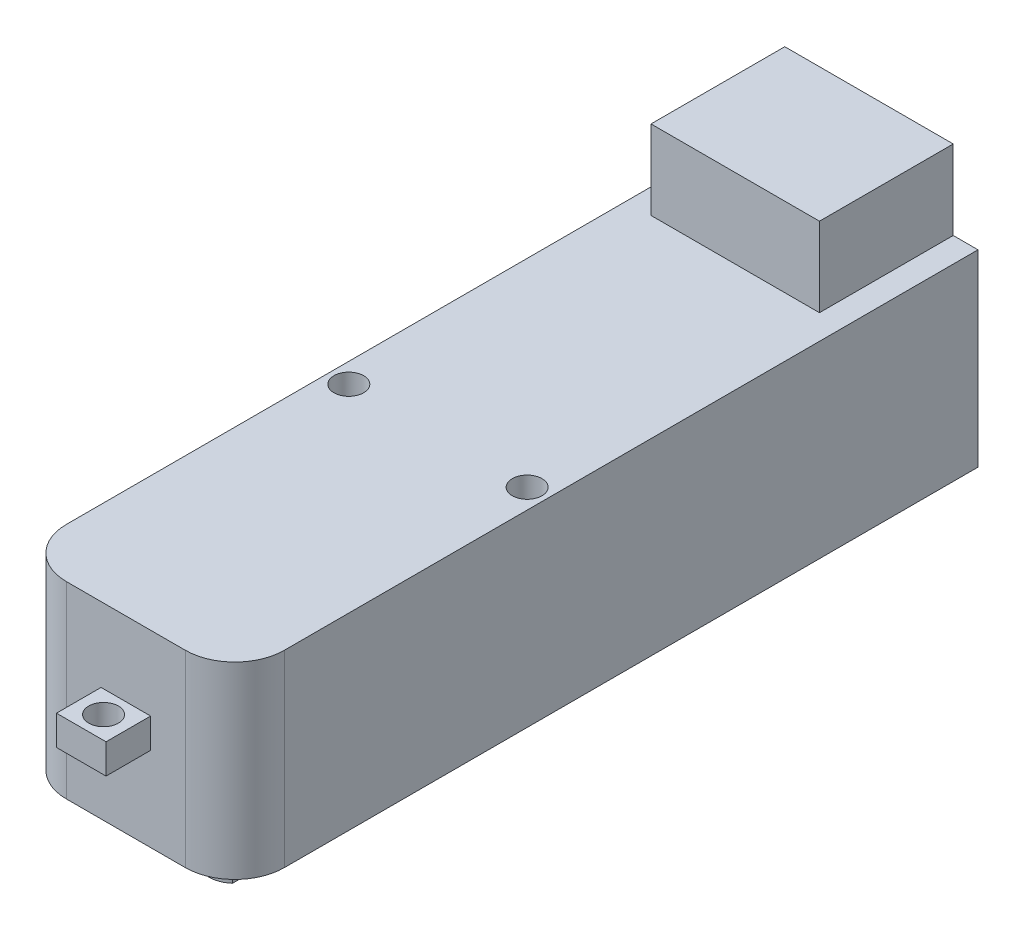
ISO-10303-21;
HEADER;
FILE_DESCRIPTION(('STEP AP214'),'2;1');
FILE_NAME('part.step','',(''),(''),'','','');
FILE_SCHEMA(('AUTOMOTIVE_DESIGN { 1 0 10303 214 1 1 1 1 }'));
ENDSEC;
DATA;
#1=APPLICATION_CONTEXT('core data for automotive mechanical design processes');
#2=APPLICATION_PROTOCOL_DEFINITION('international standard','automotive_design',2000,#1);
#3=PRODUCT_CONTEXT('',#1,'mechanical');
#4=PRODUCT('Part','Part','',(#3));
#5=PRODUCT_RELATED_PRODUCT_CATEGORY('part','',(#4));
#6=PRODUCT_DEFINITION_FORMATION('','',#4);
#7=PRODUCT_DEFINITION_CONTEXT('part definition',#1,'design');
#8=PRODUCT_DEFINITION('design','',#6,#7);
#9=PRODUCT_DEFINITION_SHAPE('','',#8);
#10=(LENGTH_UNIT() NAMED_UNIT(*) SI_UNIT(.MILLI.,.METRE.));
#11=(NAMED_UNIT(*) PLANE_ANGLE_UNIT() SI_UNIT($,.RADIAN.));
#12=(NAMED_UNIT(*) SI_UNIT($,.STERADIAN.) SOLID_ANGLE_UNIT());
#13=UNCERTAINTY_MEASURE_WITH_UNIT(LENGTH_MEASURE(1.E-05),#10,'distance_accuracy_value','');
#14=(GEOMETRIC_REPRESENTATION_CONTEXT(3) GLOBAL_UNCERTAINTY_ASSIGNED_CONTEXT((#13)) GLOBAL_UNIT_ASSIGNED_CONTEXT((#10,
#11,#12)) REPRESENTATION_CONTEXT('',''));
#15=CARTESIAN_POINT('',(0.,0.,0.));
#16=DIRECTION('',(0.,0.,1.));
#17=DIRECTION('',(1.,0.,0.));
#18=AXIS2_PLACEMENT_3D('',#15,#16,#17);
#19=CARTESIAN_POINT('',(0.,19.,0.));
#20=DIRECTION('',(0.,0.,-1.));
#21=DIRECTION('',(-1.,0.,0.));
#22=AXIS2_PLACEMENT_3D('',#19,#20,#21);
#23=PLANE('',#22);
#24=DIRECTION('',(1.,0.,0.));
#25=VECTOR('',#24,1.);
#26=CARTESIAN_POINT('',(0.,19.,0.));
#27=LINE('',#26,#25);
#28=CARTESIAN_POINT('',(5.,19.,0.));
#29=VERTEX_POINT('',#28);
#30=CARTESIAN_POINT('',(17.,19.,0.));
#31=VERTEX_POINT('',#30);
#32=EDGE_CURVE('E296',#29,#31,#27,.T.);
#33=ORIENTED_EDGE('',*,*,#32,.F.);
#34=DIRECTION('',(0.,-1.,0.));
#35=VECTOR('',#34,1.);
#36=CARTESIAN_POINT('',(5.,19.,0.));
#37=LINE('',#36,#35);
#38=CARTESIAN_POINT('',(5.,0.,0.));
#39=VERTEX_POINT('',#38);
#40=EDGE_CURVE('E331',#29,#39,#37,.T.);
#41=ORIENTED_EDGE('',*,*,#40,.T.);
#42=DIRECTION('',(1.,0.,0.));
#43=VECTOR('',#42,1.);
#44=CARTESIAN_POINT('',(0.,0.,0.));
#45=LINE('',#44,#43);
#46=CARTESIAN_POINT('',(17.,0.,0.));
#47=VERTEX_POINT('',#46);
#48=EDGE_CURVE('E312',#39,#47,#45,.T.);
#49=ORIENTED_EDGE('',*,*,#48,.T.);
#50=DIRECTION('',(0.,-1.,0.));
#51=VECTOR('',#50,1.);
#52=CARTESIAN_POINT('',(17.,19.,0.));
#53=LINE('',#52,#51);
#54=EDGE_CURVE('E328',#47,#31,#53,.F.);
#55=ORIENTED_EDGE('',*,*,#54,.T.);
#56=EDGE_LOOP('',(#33,#41,#49,#55));
#57=FACE_BOUND('',#56,.T.);
#58=DIRECTION('',(0.,-1.,0.));
#59=VECTOR('',#58,1.);
#60=CARTESIAN_POINT('',(8.49999999999999,11.5,0.));
#61=LINE('',#60,#59);
#62=CARTESIAN_POINT('',(8.49999999999999,11.5,0.));
#63=VERTEX_POINT('',#62);
#64=CARTESIAN_POINT('',(8.49999999999999,8.5,0.));
#65=VERTEX_POINT('',#64);
#66=EDGE_CURVE('E194',#63,#65,#61,.T.);
#67=ORIENTED_EDGE('',*,*,#66,.F.);
#68=DIRECTION('',(-1.,0.,0.));
#69=VECTOR('',#68,1.);
#70=CARTESIAN_POINT('',(8.49999999999999,11.5,0.));
#71=LINE('',#70,#69);
#72=CARTESIAN_POINT('',(13.5,11.5,0.));
#73=VERTEX_POINT('',#72);
#74=EDGE_CURVE('E191',#73,#63,#71,.T.);
#75=ORIENTED_EDGE('',*,*,#74,.F.);
#76=DIRECTION('',(0.,1.,0.));
#77=VECTOR('',#76,1.);
#78=CARTESIAN_POINT('',(13.5,11.5,0.));
#79=LINE('',#78,#77);
#80=CARTESIAN_POINT('',(13.5,8.5,0.));
#81=VERTEX_POINT('',#80);
#82=EDGE_CURVE('E68',#81,#73,#79,.T.);
#83=ORIENTED_EDGE('',*,*,#82,.F.);
#84=DIRECTION('',(1.,0.,0.));
#85=VECTOR('',#84,1.);
#86=CARTESIAN_POINT('',(8.49999999999999,8.5,0.));
#87=LINE('',#86,#85);
#88=EDGE_CURVE('E63',#65,#81,#87,.T.);
#89=ORIENTED_EDGE('',*,*,#88,.F.);
#90=EDGE_LOOP('',(#67,#75,#83,#89));
#91=FACE_BOUND('',#90,.T.);
#92=ADVANCED_FACE('F47',(#57,#91),#23,.F.);
#93=CARTESIAN_POINT('',(11.,-8.,-11.));
#94=DIRECTION('',(0.,1.,0.));
#95=DIRECTION('',(0.,0.,1.));
#96=AXIS2_PLACEMENT_3D('',#93,#94,#95);
#97=CYLINDRICAL_SURFACE('',#96,2.65);
#98=CARTESIAN_POINT('',(11.,-8.,-11.));
#99=DIRECTION('',(0.,-1.,0.));
#100=DIRECTION('',(0.,0.,-1.));
#101=AXIS2_PLACEMENT_3D('',#98,#99,#100);
#102=CIRCLE('',#101,2.65);
#103=CARTESIAN_POINT('',(12.75,-8.,-9.01002512578676));
#104=VERTEX_POINT('',#103);
#105=CARTESIAN_POINT('',(9.24999999999999,-8.,-9.01002512578676));
#106=VERTEX_POINT('',#105);
#107=EDGE_CURVE('E241',#104,#106,#102,.T.);
#108=ORIENTED_EDGE('',*,*,#107,.F.);
#109=DIRECTION('',(0.,-1.,0.));
#110=VECTOR('',#109,1.);
#111=CARTESIAN_POINT('',(12.75,4.08044115262063,-9.01002512578676));
#112=LINE('',#111,#110);
#113=CARTESIAN_POINT('',(12.75,0.,-9.01002512578676));
#114=VERTEX_POINT('',#113);
#115=EDGE_CURVE('E211',#114,#104,#112,.T.);
#116=ORIENTED_EDGE('',*,*,#115,.F.);
#117=CARTESIAN_POINT('',(11.,0.,-11.));
#118=DIRECTION('',(0.,-1.,0.));
#119=DIRECTION('',(0.,0.,-1.));
#120=AXIS2_PLACEMENT_3D('',#117,#118,#119);
#121=CIRCLE('',#120,2.65);
#122=CARTESIAN_POINT('',(9.24999999999999,0.,-9.01002512578676));
#123=VERTEX_POINT('',#122);
#124=EDGE_CURVE('E250',#114,#123,#121,.T.);
#125=ORIENTED_EDGE('',*,*,#124,.T.);
#126=DIRECTION('',(0.,-1.,0.));
#127=VECTOR('',#126,1.);
#128=CARTESIAN_POINT('',(9.24999999999999,4.08044115262063,-9.01002512578676));
#129=LINE('',#128,#127);
#130=EDGE_CURVE('E200',#123,#106,#129,.T.);
#131=ORIENTED_EDGE('',*,*,#130,.T.);
#132=EDGE_LOOP('',(#108,#116,#125,#131));
#133=FACE_BOUND('',#132,.T.);
#134=ADVANCED_FACE('F371',(#133),#97,.T.);
#135=CARTESIAN_POINT('',(0.,19.,0.));
#136=DIRECTION('',(0.,-1.,0.));
#137=DIRECTION('',(0.,0.,-1.));
#138=AXIS2_PLACEMENT_3D('',#135,#136,#137);
#139=PLANE('',#138);
#140=CARTESIAN_POINT('',(20.,19.,-31.5));
#141=DIRECTION('',(0.,-1.,0.));
#142=DIRECTION('',(0.,0.,-1.));
#143=AXIS2_PLACEMENT_3D('',#140,#141,#142);
#144=CIRCLE('',#143,1.5);
#145=CARTESIAN_POINT('',(20.,19.,-33.));
#146=VERTEX_POINT('',#145);
#147=EDGE_CURVE('E236',#146,#146,#144,.T.);
#148=ORIENTED_EDGE('',*,*,#147,.T.);
#149=EDGE_LOOP('',(#148));
#150=FACE_BOUND('',#149,.T.);
#151=CARTESIAN_POINT('',(2.,19.,-31.5));
#152=DIRECTION('',(0.,-1.,0.));
#153=DIRECTION('',(0.,0.,-1.));
#154=AXIS2_PLACEMENT_3D('',#151,#152,#153);
#155=CIRCLE('',#154,1.5);
#156=CARTESIAN_POINT('',(2.,19.,-33.));
#157=VERTEX_POINT('',#156);
#158=EDGE_CURVE('E231',#157,#157,#155,.T.);
#159=ORIENTED_EDGE('',*,*,#158,.T.);
#160=EDGE_LOOP('',(#159));
#161=FACE_BOUND('',#160,.T.);
#162=DIRECTION('',(0.,0.,1.));
#163=VECTOR('',#162,1.);
#164=CARTESIAN_POINT('',(0.,19.,0.));
#165=LINE('',#164,#163);
#166=CARTESIAN_POINT('',(0.,19.,-75.));
#167=VERTEX_POINT('',#166);
#168=CARTESIAN_POINT('',(0.,19.,-5.));
#169=VERTEX_POINT('',#168);
#170=EDGE_CURVE('E292',#167,#169,#165,.T.);
#171=ORIENTED_EDGE('',*,*,#170,.T.);
#172=CARTESIAN_POINT('',(5.,19.,-5.));
#173=DIRECTION('',(0.,-1.,0.));
#174=DIRECTION('',(0.,0.,-1.));
#175=AXIS2_PLACEMENT_3D('',#172,#173,#174);
#176=CIRCLE('',#175,5.);
#177=EDGE_CURVE('E347',#169,#29,#176,.F.);
#178=ORIENTED_EDGE('',*,*,#177,.T.);
#179=ORIENTED_EDGE('',*,*,#32,.T.);
#180=CARTESIAN_POINT('',(17.,19.,-5.));
#181=DIRECTION('',(0.,-1.,0.));
#182=DIRECTION('',(0.,0.,-1.));
#183=AXIS2_PLACEMENT_3D('',#180,#181,#182);
#184=CIRCLE('',#183,5.);
#185=CARTESIAN_POINT('',(22.,19.,-5.));
#186=VERTEX_POINT('',#185);
#187=EDGE_CURVE('E344',#31,#186,#184,.F.);
#188=ORIENTED_EDGE('',*,*,#187,.T.);
#189=DIRECTION('',(0.,0.,-1.));
#190=VECTOR('',#189,1.);
#191=CARTESIAN_POINT('',(22.,19.,0.));
#192=LINE('',#191,#190);
#193=CARTESIAN_POINT('',(22.,19.,-75.));
#194=VERTEX_POINT('',#193);
#195=EDGE_CURVE('E301',#186,#194,#192,.T.);
#196=ORIENTED_EDGE('',*,*,#195,.T.);
#197=DIRECTION('',(-1.,0.,0.));
#198=VECTOR('',#197,1.);
#199=CARTESIAN_POINT('',(0.,19.,-75.));
#200=LINE('',#199,#198);
#201=CARTESIAN_POINT('',(19.5,19.,-75.));
#202=VERTEX_POINT('',#201);
#203=EDGE_CURVE('E305',#194,#202,#200,.T.);
#204=ORIENTED_EDGE('',*,*,#203,.T.);
#205=DIRECTION('',(0.,0.,-1.));
#206=VECTOR('',#205,1.);
#207=CARTESIAN_POINT('',(19.5,19.,-75.));
#208=LINE('',#207,#206);
#209=CARTESIAN_POINT('',(19.5,19.,-61.5));
#210=VERTEX_POINT('',#209);
#211=EDGE_CURVE('E256',#210,#202,#208,.T.);
#212=ORIENTED_EDGE('',*,*,#211,.F.);
#213=DIRECTION('',(1.,0.,0.));
#214=VECTOR('',#213,1.);
#215=CARTESIAN_POINT('',(2.5,19.,-61.5));
#216=LINE('',#215,#214);
#217=CARTESIAN_POINT('',(2.5,19.,-61.5));
#218=VERTEX_POINT('',#217);
#219=EDGE_CURVE('E269',#218,#210,#216,.T.);
#220=ORIENTED_EDGE('',*,*,#219,.F.);
#221=DIRECTION('',(0.,0.,1.));
#222=VECTOR('',#221,1.);
#223=CARTESIAN_POINT('',(2.49999999999999,19.,-75.));
#224=LINE('',#223,#222);
#225=CARTESIAN_POINT('',(2.49999999999999,19.,-75.));
#226=VERTEX_POINT('',#225);
#227=EDGE_CURVE('E245',#226,#218,#224,.T.);
#228=ORIENTED_EDGE('',*,*,#227,.F.);
#229=EDGE_CURVE('E304',#226,#167,#200,.T.);
#230=ORIENTED_EDGE('',*,*,#229,.T.);
#231=EDGE_LOOP('',(#171,#178,#179,#188,#196,#204,#212,#220,#228,#230));
#232=FACE_BOUND('',#231,.T.);
#233=ADVANCED_FACE('F391',(#150,#161,#232),#139,.F.);
#234=CARTESIAN_POINT('',(0.,19.,0.));
#235=DIRECTION('',(1.,0.,0.));
#236=DIRECTION('',(0.,0.,-1.));
#237=AXIS2_PLACEMENT_3D('',#234,#235,#236);
#238=PLANE('',#237);
#239=DIRECTION('',(0.,0.,1.));
#240=VECTOR('',#239,1.);
#241=CARTESIAN_POINT('',(0.,0.,0.));
#242=LINE('',#241,#240);
#243=CARTESIAN_POINT('',(0.,0.,-75.));
#244=VERTEX_POINT('',#243);
#245=CARTESIAN_POINT('',(0.,0.,-5.));
#246=VERTEX_POINT('',#245);
#247=EDGE_CURVE('E291',#244,#246,#242,.T.);
#248=ORIENTED_EDGE('',*,*,#247,.T.);
#249=DIRECTION('',(0.,-1.,0.));
#250=VECTOR('',#249,1.);
#251=CARTESIAN_POINT('',(0.,19.,-5.));
#252=LINE('',#251,#250);
#253=EDGE_CURVE('E341',#246,#169,#252,.F.);
#254=ORIENTED_EDGE('',*,*,#253,.T.);
#255=ORIENTED_EDGE('',*,*,#170,.F.);
#256=DIRECTION('',(0.,-1.,0.));
#257=VECTOR('',#256,1.);
#258=CARTESIAN_POINT('',(0.,19.,-75.));
#259=LINE('',#258,#257);
#260=EDGE_CURVE('E308',#167,#244,#259,.T.);
#261=ORIENTED_EDGE('',*,*,#260,.T.);
#262=EDGE_LOOP('',(#248,#254,#255,#261));
#263=FACE_BOUND('',#262,.T.);
#264=ADVANCED_FACE('F400',(#263),#238,.F.);
#265=CARTESIAN_POINT('',(22.,19.,0.));
#266=DIRECTION('',(-1.,0.,0.));
#267=DIRECTION('',(0.,0.,1.));
#268=AXIS2_PLACEMENT_3D('',#265,#266,#267);
#269=PLANE('',#268);
#270=ORIENTED_EDGE('',*,*,#195,.F.);
#271=DIRECTION('',(0.,-1.,0.));
#272=VECTOR('',#271,1.);
#273=CARTESIAN_POINT('',(22.,19.,-5.));
#274=LINE('',#273,#272);
#275=CARTESIAN_POINT('',(22.,0.,-5.));
#276=VERTEX_POINT('',#275);
#277=EDGE_CURVE('E350',#186,#276,#274,.T.);
#278=ORIENTED_EDGE('',*,*,#277,.T.);
#279=DIRECTION('',(0.,0.,-1.));
#280=VECTOR('',#279,1.);
#281=CARTESIAN_POINT('',(22.,0.,0.));
#282=LINE('',#281,#280);
#283=CARTESIAN_POINT('',(22.,0.,-75.));
#284=VERTEX_POINT('',#283);
#285=EDGE_CURVE('E316',#276,#284,#282,.T.);
#286=ORIENTED_EDGE('',*,*,#285,.T.);
#287=DIRECTION('',(0.,-1.,0.));
#288=VECTOR('',#287,1.);
#289=CARTESIAN_POINT('',(22.,19.,-75.));
#290=LINE('',#289,#288);
#291=EDGE_CURVE('E324',#194,#284,#290,.T.);
#292=ORIENTED_EDGE('',*,*,#291,.F.);
#293=EDGE_LOOP('',(#270,#278,#286,#292));
#294=FACE_BOUND('',#293,.T.);
#295=ADVANCED_FACE('F415',(#294),#269,.F.);
#296=CARTESIAN_POINT('',(0.,19.,-75.));
#297=DIRECTION('',(0.,0.,1.));
#298=DIRECTION('',(1.,0.,0.));
#299=AXIS2_PLACEMENT_3D('',#296,#297,#298);
#300=PLANE('',#299);
#301=DIRECTION('',(-1.,0.,0.));
#302=VECTOR('',#301,1.);
#303=CARTESIAN_POINT('',(0.,0.,-75.));
#304=LINE('',#303,#302);
#305=EDGE_CURVE('E297',#284,#244,#304,.T.);
#306=ORIENTED_EDGE('',*,*,#305,.T.);
#307=ORIENTED_EDGE('',*,*,#260,.F.);
#308=ORIENTED_EDGE('',*,*,#229,.F.);
#309=DIRECTION('',(0.,-1.,0.));
#310=VECTOR('',#309,1.);
#311=CARTESIAN_POINT('',(2.49999999999999,27.,-75.));
#312=LINE('',#311,#310);
#313=CARTESIAN_POINT('',(2.49999999999999,27.,-75.));
#314=VERTEX_POINT('',#313);
#315=EDGE_CURVE('E265',#314,#226,#312,.T.);
#316=ORIENTED_EDGE('',*,*,#315,.F.);
#317=DIRECTION('',(-1.,0.,0.));
#318=VECTOR('',#317,1.);
#319=CARTESIAN_POINT('',(2.49999999999999,27.,-75.));
#320=LINE('',#319,#318);
#321=CARTESIAN_POINT('',(19.5,27.,-75.));
#322=VERTEX_POINT('',#321);
#323=EDGE_CURVE('E262',#322,#314,#320,.T.);
#324=ORIENTED_EDGE('',*,*,#323,.F.);
#325=DIRECTION('',(0.,-1.,0.));
#326=VECTOR('',#325,1.);
#327=CARTESIAN_POINT('',(19.5,27.,-75.));
#328=LINE('',#327,#326);
#329=EDGE_CURVE('E279',#322,#202,#328,.T.);
#330=ORIENTED_EDGE('',*,*,#329,.T.);
#331=ORIENTED_EDGE('',*,*,#203,.F.);
#332=ORIENTED_EDGE('',*,*,#291,.T.);
#333=EDGE_LOOP('',(#306,#307,#308,#316,#324,#330,#331,#332));
#334=FACE_BOUND('',#333,.T.);
#335=ADVANCED_FACE('F396',(#334),#300,.F.);
#336=CARTESIAN_POINT('',(0.,0.,0.));
#337=DIRECTION('',(0.,-1.,0.));
#338=DIRECTION('',(0.,0.,-1.));
#339=AXIS2_PLACEMENT_3D('',#336,#337,#338);
#340=PLANE('',#339);
#341=CARTESIAN_POINT('',(11.,0.,-22.15));
#342=DIRECTION('',(0.,-1.,0.));
#343=DIRECTION('',(0.,0.,-1.));
#344=AXIS2_PLACEMENT_3D('',#341,#342,#343);
#345=CIRCLE('',#344,2.);
#346=CARTESIAN_POINT('',(11.,0.,-24.15));
#347=VERTEX_POINT('',#346);
#348=EDGE_CURVE('E209',#347,#347,#345,.T.);
#349=ORIENTED_EDGE('',*,*,#348,.F.);
#350=EDGE_LOOP('',(#349));
#351=FACE_BOUND('',#350,.T.);
#352=CARTESIAN_POINT('',(20.,0.,-31.5));
#353=DIRECTION('',(0.,-1.,0.));
#354=DIRECTION('',(0.,0.,-1.));
#355=AXIS2_PLACEMENT_3D('',#352,#353,#354);
#356=CIRCLE('',#355,1.5);
#357=CARTESIAN_POINT('',(20.,0.,-33.));
#358=VERTEX_POINT('',#357);
#359=EDGE_CURVE('E235',#358,#358,#356,.T.);
#360=ORIENTED_EDGE('',*,*,#359,.F.);
#361=EDGE_LOOP('',(#360));
#362=FACE_BOUND('',#361,.T.);
#363=CARTESIAN_POINT('',(2.,0.,-31.5));
#364=DIRECTION('',(0.,-1.,0.));
#365=DIRECTION('',(0.,0.,-1.));
#366=AXIS2_PLACEMENT_3D('',#363,#364,#365);
#367=CIRCLE('',#366,1.5);
#368=CARTESIAN_POINT('',(2.,0.,-33.));
#369=VERTEX_POINT('',#368);
#370=EDGE_CURVE('E227',#369,#369,#367,.T.);
#371=ORIENTED_EDGE('',*,*,#370,.F.);
#372=EDGE_LOOP('',(#371));
#373=FACE_BOUND('',#372,.T.);
#374=ORIENTED_EDGE('',*,*,#124,.F.);
#375=DIRECTION('',(0.,0.,1.));
#376=VECTOR('',#375,1.);
#377=CARTESIAN_POINT('',(12.75,0.,-9.01002512578676));
#378=LINE('',#377,#376);
#379=CARTESIAN_POINT('',(12.75,0.,-12.9899748742132));
#380=VERTEX_POINT('',#379);
#381=EDGE_CURVE('E206',#380,#114,#378,.T.);
#382=ORIENTED_EDGE('',*,*,#381,.F.);
#383=CARTESIAN_POINT('',(9.24999999999999,0.,-12.9899748742132));
#384=VERTEX_POINT('',#383);
#385=EDGE_CURVE('E240',#384,#380,#121,.T.);
#386=ORIENTED_EDGE('',*,*,#385,.F.);
#387=DIRECTION('',(0.,0.,-1.));
#388=VECTOR('',#387,1.);
#389=CARTESIAN_POINT('',(9.24999999999999,0.,-9.01002512578676));
#390=LINE('',#389,#388);
#391=EDGE_CURVE('E196',#123,#384,#390,.T.);
#392=ORIENTED_EDGE('',*,*,#391,.F.);
#393=EDGE_LOOP('',(#374,#382,#386,#392));
#394=FACE_BOUND('',#393,.T.);
#395=ORIENTED_EDGE('',*,*,#48,.F.);
#396=CARTESIAN_POINT('',(5.,0.,-5.));
#397=DIRECTION('',(0.,-1.,0.));
#398=DIRECTION('',(0.,0.,-1.));
#399=AXIS2_PLACEMENT_3D('',#396,#397,#398);
#400=CIRCLE('',#399,5.);
#401=EDGE_CURVE('E338',#39,#246,#400,.T.);
#402=ORIENTED_EDGE('',*,*,#401,.T.);
#403=ORIENTED_EDGE('',*,*,#247,.F.);
#404=ORIENTED_EDGE('',*,*,#305,.F.);
#405=ORIENTED_EDGE('',*,*,#285,.F.);
#406=CARTESIAN_POINT('',(17.,0.,-5.));
#407=DIRECTION('',(0.,-1.,0.));
#408=DIRECTION('',(0.,0.,-1.));
#409=AXIS2_PLACEMENT_3D('',#406,#407,#408);
#410=CIRCLE('',#409,5.);
#411=EDGE_CURVE('E335',#276,#47,#410,.T.);
#412=ORIENTED_EDGE('',*,*,#411,.T.);
#413=EDGE_LOOP('',(#395,#402,#403,#404,#405,#412));
#414=FACE_BOUND('',#413,.T.);
#415=ADVANCED_FACE('F383',(#351,#362,#373,#394,#414),#340,.T.);
#416=CARTESIAN_POINT('',(2.49999999999999,27.,-75.));
#417=DIRECTION('',(1.,0.,0.));
#418=DIRECTION('',(0.,0.,-1.));
#419=AXIS2_PLACEMENT_3D('',#416,#417,#418);
#420=PLANE('',#419);
#421=ORIENTED_EDGE('',*,*,#227,.T.);
#422=DIRECTION('',(0.,-1.,0.));
#423=VECTOR('',#422,1.);
#424=CARTESIAN_POINT('',(2.5,27.,-61.5));
#425=LINE('',#424,#423);
#426=CARTESIAN_POINT('',(2.5,27.,-61.5));
#427=VERTEX_POINT('',#426);
#428=EDGE_CURVE('E287',#427,#218,#425,.T.);
#429=ORIENTED_EDGE('',*,*,#428,.F.);
#430=DIRECTION('',(0.,0.,1.));
#431=VECTOR('',#430,1.);
#432=CARTESIAN_POINT('',(2.49999999999999,27.,-75.));
#433=LINE('',#432,#431);
#434=EDGE_CURVE('E251',#314,#427,#433,.T.);
#435=ORIENTED_EDGE('',*,*,#434,.F.);
#436=ORIENTED_EDGE('',*,*,#315,.T.);
#437=EDGE_LOOP('',(#421,#429,#435,#436));
#438=FACE_BOUND('',#437,.T.);
#439=ADVANCED_FACE('F429',(#438),#420,.F.);
#440=CARTESIAN_POINT('',(2.5,27.,-61.5));
#441=DIRECTION('',(0.,0.,-1.));
#442=DIRECTION('',(-1.,0.,0.));
#443=AXIS2_PLACEMENT_3D('',#440,#441,#442);
#444=PLANE('',#443);
#445=ORIENTED_EDGE('',*,*,#219,.T.);
#446=DIRECTION('',(0.,-1.,0.));
#447=VECTOR('',#446,1.);
#448=CARTESIAN_POINT('',(19.5,27.,-61.5));
#449=LINE('',#448,#447);
#450=CARTESIAN_POINT('',(19.5,27.,-61.5));
#451=VERTEX_POINT('',#450);
#452=EDGE_CURVE('E283',#451,#210,#449,.T.);
#453=ORIENTED_EDGE('',*,*,#452,.F.);
#454=DIRECTION('',(1.,0.,0.));
#455=VECTOR('',#454,1.);
#456=CARTESIAN_POINT('',(2.5,27.,-61.5));
#457=LINE('',#456,#455);
#458=EDGE_CURVE('E255',#427,#451,#457,.T.);
#459=ORIENTED_EDGE('',*,*,#458,.F.);
#460=ORIENTED_EDGE('',*,*,#428,.T.);
#461=EDGE_LOOP('',(#445,#453,#459,#460));
#462=FACE_BOUND('',#461,.T.);
#463=ADVANCED_FACE('F425',(#462),#444,.F.);
#464=CARTESIAN_POINT('',(19.5,27.,-75.));
#465=DIRECTION('',(-1.,0.,0.));
#466=DIRECTION('',(0.,0.,1.));
#467=AXIS2_PLACEMENT_3D('',#464,#465,#466);
#468=PLANE('',#467);
#469=ORIENTED_EDGE('',*,*,#211,.T.);
#470=ORIENTED_EDGE('',*,*,#329,.F.);
#471=DIRECTION('',(0.,0.,-1.));
#472=VECTOR('',#471,1.);
#473=CARTESIAN_POINT('',(19.5,27.,-75.));
#474=LINE('',#473,#472);
#475=EDGE_CURVE('E259',#451,#322,#474,.T.);
#476=ORIENTED_EDGE('',*,*,#475,.F.);
#477=ORIENTED_EDGE('',*,*,#452,.T.);
#478=EDGE_LOOP('',(#469,#470,#476,#477));
#479=FACE_BOUND('',#478,.T.);
#480=ADVANCED_FACE('F421',(#479),#468,.F.);
#481=CARTESIAN_POINT('',(0.,27.,0.));
#482=DIRECTION('',(0.,1.,0.));
#483=DIRECTION('',(0.,0.,1.));
#484=AXIS2_PLACEMENT_3D('',#481,#482,#483);
#485=PLANE('',#484);
#486=ORIENTED_EDGE('',*,*,#434,.T.);
#487=ORIENTED_EDGE('',*,*,#458,.T.);
#488=ORIENTED_EDGE('',*,*,#475,.T.);
#489=ORIENTED_EDGE('',*,*,#323,.T.);
#490=EDGE_LOOP('',(#486,#487,#488,#489));
#491=FACE_BOUND('',#490,.T.);
#492=ADVANCED_FACE('F431',(#491),#485,.T.);
#493=CARTESIAN_POINT('',(5.,19.,-5.));
#494=DIRECTION('',(0.,-1.,0.));
#495=DIRECTION('',(0.,0.,-1.));
#496=AXIS2_PLACEMENT_3D('',#493,#494,#495);
#497=CYLINDRICAL_SURFACE('',#496,5.);
#498=ORIENTED_EDGE('',*,*,#177,.F.);
#499=ORIENTED_EDGE('',*,*,#253,.F.);
#500=ORIENTED_EDGE('',*,*,#401,.F.);
#501=ORIENTED_EDGE('',*,*,#40,.F.);
#502=EDGE_LOOP('',(#498,#499,#500,#501));
#503=FACE_BOUND('',#502,.T.);
#504=ADVANCED_FACE('F403',(#503),#497,.T.);
#505=CARTESIAN_POINT('',(17.,19.,-5.));
#506=DIRECTION('',(0.,-1.,0.));
#507=DIRECTION('',(0.,0.,-1.));
#508=AXIS2_PLACEMENT_3D('',#505,#506,#507);
#509=CYLINDRICAL_SURFACE('',#508,5.);
#510=ORIENTED_EDGE('',*,*,#187,.F.);
#511=ORIENTED_EDGE('',*,*,#54,.F.);
#512=ORIENTED_EDGE('',*,*,#411,.F.);
#513=ORIENTED_EDGE('',*,*,#277,.F.);
#514=EDGE_LOOP('',(#510,#511,#512,#513));
#515=FACE_BOUND('',#514,.T.);
#516=ADVANCED_FACE('F49',(#515),#509,.T.);
#517=ORIENTED_EDGE('',*,*,#385,.T.);
#518=DIRECTION('',(0.,-1.,0.));
#519=VECTOR('',#518,1.);
#520=CARTESIAN_POINT('',(12.75,4.08044115262063,-12.9899748742132));
#521=LINE('',#520,#519);
#522=CARTESIAN_POINT('',(12.75,-8.,-12.9899748742132));
#523=VERTEX_POINT('',#522);
#524=EDGE_CURVE('E210',#380,#523,#521,.T.);
#525=ORIENTED_EDGE('',*,*,#524,.T.);
#526=CARTESIAN_POINT('',(9.24999999999999,-8.,-12.9899748742132));
#527=VERTEX_POINT('',#526);
#528=EDGE_CURVE('E246',#527,#523,#102,.T.);
#529=ORIENTED_EDGE('',*,*,#528,.F.);
#530=DIRECTION('',(0.,-1.,0.));
#531=VECTOR('',#530,1.);
#532=CARTESIAN_POINT('',(9.24999999999999,4.08044115262063,-12.9899748742132));
#533=LINE('',#532,#531);
#534=EDGE_CURVE('E214',#384,#527,#533,.T.);
#535=ORIENTED_EDGE('',*,*,#534,.F.);
#536=EDGE_LOOP('',(#517,#525,#529,#535));
#537=FACE_BOUND('',#536,.T.);
#538=ADVANCED_FACE('F380',(#537),#97,.T.);
#539=CARTESIAN_POINT('',(11.,-8.,-11.));
#540=DIRECTION('',(0.,-1.,0.));
#541=DIRECTION('',(0.,0.,-1.));
#542=AXIS2_PLACEMENT_3D('',#539,#540,#541);
#543=PLANE('',#542);
#544=DIRECTION('',(0.,0.,1.));
#545=VECTOR('',#544,1.);
#546=CARTESIAN_POINT('',(12.75,-8.,-9.01002512578676));
#547=LINE('',#546,#545);
#548=EDGE_CURVE('E12',#104,#523,#547,.F.);
#549=ORIENTED_EDGE('',*,*,#548,.F.);
#550=ORIENTED_EDGE('',*,*,#107,.T.);
#551=DIRECTION('',(0.,0.,-1.));
#552=VECTOR('',#551,1.);
#553=CARTESIAN_POINT('',(9.24999999999999,-8.,-9.01002512578676));
#554=LINE('',#553,#552);
#555=EDGE_CURVE('E56',#527,#106,#554,.F.);
#556=ORIENTED_EDGE('',*,*,#555,.F.);
#557=ORIENTED_EDGE('',*,*,#528,.T.);
#558=EDGE_LOOP('',(#549,#550,#556,#557));
#559=FACE_BOUND('',#558,.T.);
#560=ADVANCED_FACE('F375',(#559),#543,.T.);
#561=CARTESIAN_POINT('',(2.,27.,-31.5));
#562=DIRECTION('',(0.,-1.,0.));
#563=DIRECTION('',(0.,0.,-1.));
#564=AXIS2_PLACEMENT_3D('',#561,#562,#563);
#565=CYLINDRICAL_SURFACE('',#564,1.5);
#566=ORIENTED_EDGE('',*,*,#370,.T.);
#567=EDGE_LOOP('',(#566));
#568=FACE_BOUND('',#567,.T.);
#569=ORIENTED_EDGE('',*,*,#158,.F.);
#570=EDGE_LOOP('',(#569));
#571=FACE_BOUND('',#570,.T.);
#572=ADVANCED_FACE('F521',(#568,#571),#565,.F.);
#573=CARTESIAN_POINT('',(20.,27.,-31.5));
#574=DIRECTION('',(0.,-1.,0.));
#575=DIRECTION('',(0.,0.,-1.));
#576=AXIS2_PLACEMENT_3D('',#573,#574,#575);
#577=CYLINDRICAL_SURFACE('',#576,1.5);
#578=ORIENTED_EDGE('',*,*,#359,.T.);
#579=EDGE_LOOP('',(#578));
#580=FACE_BOUND('',#579,.T.);
#581=ORIENTED_EDGE('',*,*,#147,.F.);
#582=EDGE_LOOP('',(#581));
#583=FACE_BOUND('',#582,.T.);
#584=ADVANCED_FACE('F530',(#580,#583),#577,.F.);
#585=CARTESIAN_POINT('',(11.,-2.,-22.15));
#586=DIRECTION('',(0.,1.,0.));
#587=DIRECTION('',(0.,0.,1.));
#588=AXIS2_PLACEMENT_3D('',#585,#586,#587);
#589=CYLINDRICAL_SURFACE('',#588,2.);
#590=CARTESIAN_POINT('',(11.,-2.,-22.15));
#591=DIRECTION('',(0.,-1.,0.));
#592=DIRECTION('',(0.,0.,-1.));
#593=AXIS2_PLACEMENT_3D('',#590,#591,#592);
#594=CIRCLE('',#593,2.);
#595=CARTESIAN_POINT('',(11.,-2.,-24.15));
#596=VERTEX_POINT('',#595);
#597=EDGE_CURVE('E223',#596,#596,#594,.T.);
#598=ORIENTED_EDGE('',*,*,#597,.F.);
#599=EDGE_LOOP('',(#598));
#600=FACE_BOUND('',#599,.T.);
#601=ORIENTED_EDGE('',*,*,#348,.T.);
#602=EDGE_LOOP('',(#601));
#603=FACE_BOUND('',#602,.T.);
#604=ADVANCED_FACE('F540',(#600,#603),#589,.T.);
#605=CARTESIAN_POINT('',(11.,-2.,-22.15));
#606=DIRECTION('',(0.,-1.,0.));
#607=DIRECTION('',(0.,0.,-1.));
#608=AXIS2_PLACEMENT_3D('',#605,#606,#607);
#609=PLANE('',#608);
#610=ORIENTED_EDGE('',*,*,#597,.T.);
#611=EDGE_LOOP('',(#610));
#612=FACE_BOUND('',#611,.T.);
#613=ADVANCED_FACE('F550',(#612),#609,.T.);
#614=CARTESIAN_POINT('',(9.24999999999999,4.08044115262063,-9.01002512578676));
#615=DIRECTION('',(1.,0.,0.));
#616=DIRECTION('',(0.,0.,-1.));
#617=AXIS2_PLACEMENT_3D('',#614,#615,#616);
#618=PLANE('',#617);
#619=ORIENTED_EDGE('',*,*,#555,.T.);
#620=ORIENTED_EDGE('',*,*,#130,.F.);
#621=ORIENTED_EDGE('',*,*,#391,.T.);
#622=ORIENTED_EDGE('',*,*,#534,.T.);
#623=EDGE_LOOP('',(#619,#620,#621,#622));
#624=FACE_BOUND('',#623,.T.);
#625=ADVANCED_FACE('F362',(#624),#618,.F.);
#626=CARTESIAN_POINT('',(12.75,4.08044115262063,-9.01002512578676));
#627=DIRECTION('',(-1.,0.,0.));
#628=DIRECTION('',(0.,0.,1.));
#629=AXIS2_PLACEMENT_3D('',#626,#627,#628);
#630=PLANE('',#629);
#631=ORIENTED_EDGE('',*,*,#548,.T.);
#632=ORIENTED_EDGE('',*,*,#524,.F.);
#633=ORIENTED_EDGE('',*,*,#381,.T.);
#634=ORIENTED_EDGE('',*,*,#115,.T.);
#635=EDGE_LOOP('',(#631,#632,#633,#634));
#636=FACE_BOUND('',#635,.T.);
#637=ADVANCED_FACE('F377',(#636),#630,.F.);
#638=CARTESIAN_POINT('',(8.49999999999999,11.5,4.5));
#639=DIRECTION('',(1.,0.,0.));
#640=DIRECTION('',(0.,0.,-1.));
#641=AXIS2_PLACEMENT_3D('',#638,#639,#640);
#642=PLANE('',#641);
#643=ORIENTED_EDGE('',*,*,#66,.T.);
#644=DIRECTION('',(0.,0.,-1.));
#645=VECTOR('',#644,1.);
#646=CARTESIAN_POINT('',(8.49999999999999,8.5,4.5));
#647=LINE('',#646,#645);
#648=CARTESIAN_POINT('',(8.49999999999999,8.5,4.5));
#649=VERTEX_POINT('',#648);
#650=EDGE_CURVE('E173',#649,#65,#647,.T.);
#651=ORIENTED_EDGE('',*,*,#650,.F.);
#652=DIRECTION('',(0.,-1.,0.));
#653=VECTOR('',#652,1.);
#654=CARTESIAN_POINT('',(8.49999999999999,11.5,4.5));
#655=LINE('',#654,#653);
#656=CARTESIAN_POINT('',(8.49999999999999,11.5,4.5));
#657=VERTEX_POINT('',#656);
#658=EDGE_CURVE('E181',#657,#649,#655,.T.);
#659=ORIENTED_EDGE('',*,*,#658,.F.);
#660=DIRECTION('',(0.,0.,-1.));
#661=VECTOR('',#660,1.);
#662=CARTESIAN_POINT('',(8.49999999999999,11.5,4.5));
#663=LINE('',#662,#661);
#664=EDGE_CURVE('E664',#657,#63,#663,.T.);
#665=ORIENTED_EDGE('',*,*,#664,.T.);
#666=EDGE_LOOP('',(#643,#651,#659,#665));
#667=FACE_BOUND('',#666,.T.);
#668=ADVANCED_FACE('F193',(#667),#642,.F.);
#669=CARTESIAN_POINT('',(8.49999999999999,8.5,4.5));
#670=DIRECTION('',(0.,1.,0.));
#671=DIRECTION('',(0.,0.,1.));
#672=AXIS2_PLACEMENT_3D('',#669,#670,#671);
#673=PLANE('',#672);
#674=CARTESIAN_POINT('',(11.,8.5,2.25));
#675=DIRECTION('',(0.,1.,0.));
#676=DIRECTION('',(0.,0.,1.));
#677=AXIS2_PLACEMENT_3D('',#674,#675,#676);
#678=CIRCLE('',#677,1.5);
#679=CARTESIAN_POINT('',(11.,8.5,3.75));
#680=VERTEX_POINT('',#679);
#681=EDGE_CURVE('E651',#680,#680,#678,.F.);
#682=ORIENTED_EDGE('',*,*,#681,.F.);
#683=EDGE_LOOP('',(#682));
#684=FACE_BOUND('',#683,.T.);
#685=ORIENTED_EDGE('',*,*,#88,.T.);
#686=DIRECTION('',(0.,0.,-1.));
#687=VECTOR('',#686,1.);
#688=CARTESIAN_POINT('',(13.5,8.5,4.5));
#689=LINE('',#688,#687);
#690=CARTESIAN_POINT('',(13.5,8.5,4.5));
#691=VERTEX_POINT('',#690);
#692=EDGE_CURVE('E176',#691,#81,#689,.T.);
#693=ORIENTED_EDGE('',*,*,#692,.F.);
#694=DIRECTION('',(1.,0.,0.));
#695=VECTOR('',#694,1.);
#696=CARTESIAN_POINT('',(8.49999999999999,8.5,4.5));
#697=LINE('',#696,#695);
#698=EDGE_CURVE('E169',#649,#691,#697,.T.);
#699=ORIENTED_EDGE('',*,*,#698,.F.);
#700=ORIENTED_EDGE('',*,*,#650,.T.);
#701=EDGE_LOOP('',(#685,#693,#699,#700));
#702=FACE_BOUND('',#701,.T.);
#703=ADVANCED_FACE('F171',(#684,#702),#673,.F.);
#704=CARTESIAN_POINT('',(13.5,11.5,4.5));
#705=DIRECTION('',(-1.,0.,0.));
#706=DIRECTION('',(0.,0.,1.));
#707=AXIS2_PLACEMENT_3D('',#704,#705,#706);
#708=PLANE('',#707);
#709=ORIENTED_EDGE('',*,*,#82,.T.);
#710=DIRECTION('',(0.,0.,-1.));
#711=VECTOR('',#710,1.);
#712=CARTESIAN_POINT('',(13.5,11.5,4.5));
#713=LINE('',#712,#711);
#714=CARTESIAN_POINT('',(13.5,11.5,4.5));
#715=VERTEX_POINT('',#714);
#716=EDGE_CURVE('E202',#715,#73,#713,.T.);
#717=ORIENTED_EDGE('',*,*,#716,.F.);
#718=DIRECTION('',(0.,1.,0.));
#719=VECTOR('',#718,1.);
#720=CARTESIAN_POINT('',(13.5,11.5,4.5));
#721=LINE('',#720,#719);
#722=EDGE_CURVE('E180',#691,#715,#721,.T.);
#723=ORIENTED_EDGE('',*,*,#722,.F.);
#724=ORIENTED_EDGE('',*,*,#692,.T.);
#725=EDGE_LOOP('',(#709,#717,#723,#724));
#726=FACE_BOUND('',#725,.T.);
#727=ADVANCED_FACE('F608',(#726),#708,.F.);
#728=CARTESIAN_POINT('',(8.49999999999999,11.5,4.5));
#729=DIRECTION('',(0.,-1.,0.));
#730=DIRECTION('',(1.,0.,0.));
#731=AXIS2_PLACEMENT_3D('',#728,#729,#730);
#732=PLANE('',#731);
#733=CARTESIAN_POINT('',(11.,11.5,2.25));
#734=DIRECTION('',(0.,1.,0.));
#735=DIRECTION('',(-1.,0.,0.));
#736=AXIS2_PLACEMENT_3D('',#733,#734,#735);
#737=CIRCLE('',#736,1.5);
#738=CARTESIAN_POINT('',(9.49999999999999,11.5,2.25));
#739=VERTEX_POINT('',#738);
#740=EDGE_CURVE('E654',#739,#739,#737,.T.);
#741=ORIENTED_EDGE('',*,*,#740,.F.);
#742=EDGE_LOOP('',(#741));
#743=FACE_BOUND('',#742,.T.);
#744=ORIENTED_EDGE('',*,*,#74,.T.);
#745=ORIENTED_EDGE('',*,*,#664,.F.);
#746=DIRECTION('',(-1.,0.,0.));
#747=VECTOR('',#746,1.);
#748=CARTESIAN_POINT('',(8.49999999999999,11.5,4.5));
#749=LINE('',#748,#747);
#750=EDGE_CURVE('E186',#715,#657,#749,.T.);
#751=ORIENTED_EDGE('',*,*,#750,.F.);
#752=ORIENTED_EDGE('',*,*,#716,.T.);
#753=EDGE_LOOP('',(#744,#745,#751,#752));
#754=FACE_BOUND('',#753,.T.);
#755=ADVANCED_FACE('F619',(#743,#754),#732,.F.);
#756=CARTESIAN_POINT('',(0.,0.,4.5));
#757=DIRECTION('',(0.,0.,1.));
#758=DIRECTION('',(1.,0.,0.));
#759=AXIS2_PLACEMENT_3D('',#756,#757,#758);
#760=PLANE('',#759);
#761=ORIENTED_EDGE('',*,*,#658,.T.);
#762=ORIENTED_EDGE('',*,*,#698,.T.);
#763=ORIENTED_EDGE('',*,*,#722,.T.);
#764=ORIENTED_EDGE('',*,*,#750,.T.);
#765=EDGE_LOOP('',(#761,#762,#763,#764));
#766=FACE_BOUND('',#765,.T.);
#767=ADVANCED_FACE('F184',(#766),#760,.T.);
#768=CARTESIAN_POINT('',(11.,4.25735931288071,2.25));
#769=DIRECTION('',(0.,1.,0.));
#770=DIRECTION('',(-1.,0.,0.));
#771=AXIS2_PLACEMENT_3D('',#768,#769,#770);
#772=CYLINDRICAL_SURFACE('',#771,1.5);
#773=ORIENTED_EDGE('',*,*,#681,.T.);
#774=EDGE_LOOP('',(#773));
#775=FACE_BOUND('',#774,.T.);
#776=ORIENTED_EDGE('',*,*,#740,.T.);
#777=EDGE_LOOP('',(#776));
#778=FACE_BOUND('',#777,.T.);
#779=ADVANCED_FACE('F637',(#775,#778),#772,.F.);
#780=CLOSED_SHELL('',(#92,#134,#233,#264,#295,#335,#415,#439,#463,#480,#492,#504,#516,#538,#560,
#572,#584,#604,#613,#625,#637,#668,#703,#727,#755,#767,#779));
#781=MANIFOLD_SOLID_BREP('B2',#780);
#782=ADVANCED_BREP_SHAPE_REPRESENTATION('',(#18,#781),#14);
#783=SHAPE_DEFINITION_REPRESENTATION(#9,#782);
ENDSEC;
END-ISO-10303-21;
